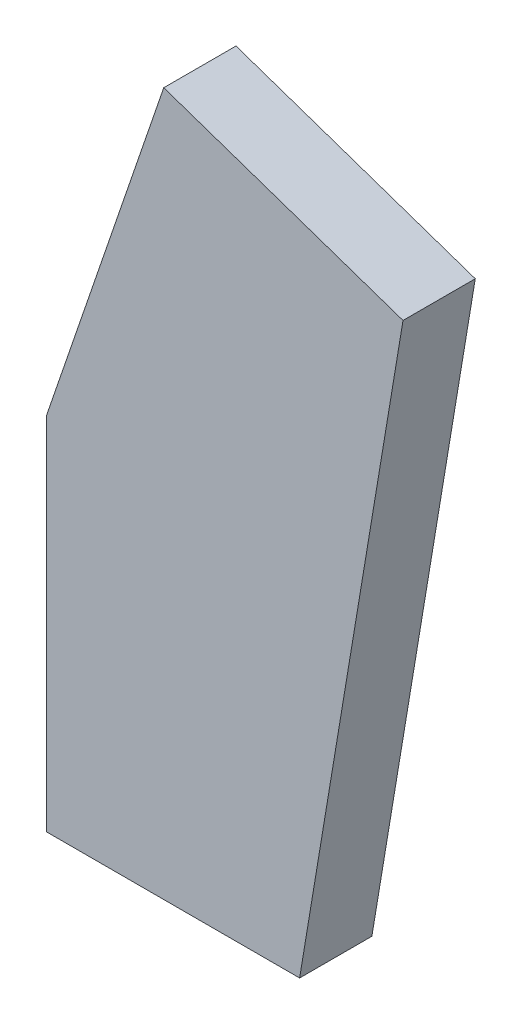
ISO-10303-21;
HEADER;
FILE_DESCRIPTION(('STEP AP214'),'2;1');
FILE_NAME('part.step','',(''),(''),'','','');
FILE_SCHEMA(('AUTOMOTIVE_DESIGN { 1 0 10303 214 1 1 1 1 }'));
ENDSEC;
DATA;
#1=APPLICATION_CONTEXT('core data for automotive mechanical design processes');
#2=APPLICATION_PROTOCOL_DEFINITION('international standard','automotive_design',2000,#1);
#3=PRODUCT_CONTEXT('',#1,'mechanical');
#4=PRODUCT('Part','Part','',(#3));
#5=PRODUCT_RELATED_PRODUCT_CATEGORY('part','',(#4));
#6=PRODUCT_DEFINITION_FORMATION('','',#4);
#7=PRODUCT_DEFINITION_CONTEXT('part definition',#1,'design');
#8=PRODUCT_DEFINITION('design','',#6,#7);
#9=PRODUCT_DEFINITION_SHAPE('','',#8);
#10=(LENGTH_UNIT() NAMED_UNIT(*) SI_UNIT(.MILLI.,.METRE.));
#11=(NAMED_UNIT(*) PLANE_ANGLE_UNIT() SI_UNIT($,.RADIAN.));
#12=(NAMED_UNIT(*) SI_UNIT($,.STERADIAN.) SOLID_ANGLE_UNIT());
#13=UNCERTAINTY_MEASURE_WITH_UNIT(LENGTH_MEASURE(1.E-05),#10,'distance_accuracy_value','');
#14=(GEOMETRIC_REPRESENTATION_CONTEXT(3) GLOBAL_UNCERTAINTY_ASSIGNED_CONTEXT((#13)) GLOBAL_UNIT_ASSIGNED_CONTEXT((#10,
#11,#12)) REPRESENTATION_CONTEXT('',''));
#15=CARTESIAN_POINT('',(0.,0.,0.));
#16=DIRECTION('',(0.,0.,1.));
#17=DIRECTION('',(1.,0.,0.));
#18=AXIS2_PLACEMENT_3D('',#15,#16,#17);
#19=CARTESIAN_POINT('',(0.,-50.,10.));
#20=DIRECTION('',(0.,1.,0.));
#21=DIRECTION('',(0.,0.,1.));
#22=AXIS2_PLACEMENT_3D('',#19,#20,#21);
#23=PLANE('',#22);
#24=DIRECTION('',(1.,0.,0.));
#25=VECTOR('',#24,1.);
#26=CARTESIAN_POINT('',(0.,-50.,0.));
#27=LINE('',#26,#25);
#28=CARTESIAN_POINT('',(0.,-50.,0.));
#29=VERTEX_POINT('',#28);
#30=CARTESIAN_POINT('',(35.,-50.,0.));
#31=VERTEX_POINT('',#30);
#32=EDGE_CURVE('E107',#29,#31,#27,.T.);
#33=ORIENTED_EDGE('',*,*,#32,.T.);
#34=DIRECTION('',(0.,0.,-1.));
#35=VECTOR('',#34,1.);
#36=CARTESIAN_POINT('',(35.,-50.,10.));
#37=LINE('',#36,#35);
#38=CARTESIAN_POINT('',(35.,-50.,10.));
#39=VERTEX_POINT('',#38);
#40=EDGE_CURVE('E11',#39,#31,#37,.T.);
#41=ORIENTED_EDGE('',*,*,#40,.F.);
#42=DIRECTION('',(1.,0.,0.));
#43=VECTOR('',#42,1.);
#44=CARTESIAN_POINT('',(0.,-50.,10.));
#45=LINE('',#44,#43);
#46=CARTESIAN_POINT('',(0.,-50.,10.));
#47=VERTEX_POINT('',#46);
#48=EDGE_CURVE('E115',#47,#39,#45,.T.);
#49=ORIENTED_EDGE('',*,*,#48,.F.);
#50=DIRECTION('',(0.,0.,-1.));
#51=VECTOR('',#50,1.);
#52=CARTESIAN_POINT('',(0.,-50.,10.));
#53=LINE('',#52,#51);
#54=EDGE_CURVE('E103',#47,#29,#53,.T.);
#55=ORIENTED_EDGE('',*,*,#54,.T.);
#56=EDGE_LOOP('',(#33,#41,#49,#55));
#57=FACE_BOUND('',#56,.T.);
#58=ADVANCED_FACE('F33',(#57),#23,.F.);
#59=CARTESIAN_POINT('',(49.3088584688714,35.9671583044422,10.));
#60=DIRECTION('',(-0.986429257176496,0.164186846568861,0.));
#61=DIRECTION('',(-0.164186846568861,-0.986429257176496,0.));
#62=AXIS2_PLACEMENT_3D('',#59,#60,#61);
#63=PLANE('',#62);
#64=DIRECTION('',(0.164186846568861,0.986429257176496,0.));
#65=VECTOR('',#64,1.);
#66=CARTESIAN_POINT('',(49.3088584688714,35.9671583044422,0.));
#67=LINE('',#66,#65);
#68=CARTESIAN_POINT('',(49.3088584688714,35.9671583044422,0.));
#69=VERTEX_POINT('',#68);
#70=EDGE_CURVE('E110',#31,#69,#67,.T.);
#71=ORIENTED_EDGE('',*,*,#70,.T.);
#72=DIRECTION('',(0.,0.,-1.));
#73=VECTOR('',#72,1.);
#74=CARTESIAN_POINT('',(49.3088584688714,35.9671583044422,10.));
#75=LINE('',#74,#73);
#76=CARTESIAN_POINT('',(49.3088584688714,35.9671583044422,10.));
#77=VERTEX_POINT('',#76);
#78=EDGE_CURVE('E41',#77,#69,#75,.T.);
#79=ORIENTED_EDGE('',*,*,#78,.F.);
#80=DIRECTION('',(0.164186846568861,0.986429257176496,0.));
#81=VECTOR('',#80,1.);
#82=CARTESIAN_POINT('',(49.3088584688714,35.9671583044422,10.));
#83=LINE('',#82,#81);
#84=EDGE_CURVE('E83',#39,#77,#83,.T.);
#85=ORIENTED_EDGE('',*,*,#84,.F.);
#86=ORIENTED_EDGE('',*,*,#40,.T.);
#87=EDGE_LOOP('',(#71,#79,#85,#86));
#88=FACE_BOUND('',#87,.T.);
#89=ADVANCED_FACE('F134',(#88),#63,.F.);
#90=CARTESIAN_POINT('',(16.1958709099073,47.3042679413773,10.));
#91=DIRECTION('',(-0.323917418198147,-0.946085358827546,0.));
#92=DIRECTION('',(0.946085358827546,-0.323917418198147,0.));
#93=AXIS2_PLACEMENT_3D('',#90,#91,#92);
#94=PLANE('',#93);
#95=DIRECTION('',(-0.946085358827546,0.323917418198147,0.));
#96=VECTOR('',#95,1.);
#97=CARTESIAN_POINT('',(16.1958709099073,47.3042679413773,0.));
#98=LINE('',#97,#96);
#99=CARTESIAN_POINT('',(16.1958709099073,47.3042679413773,0.));
#100=VERTEX_POINT('',#99);
#101=EDGE_CURVE('E98',#69,#100,#98,.T.);
#102=ORIENTED_EDGE('',*,*,#101,.T.);
#103=DIRECTION('',(0.,0.,-1.));
#104=VECTOR('',#103,1.);
#105=CARTESIAN_POINT('',(16.1958709099073,47.3042679413773,10.));
#106=LINE('',#105,#104);
#107=CARTESIAN_POINT('',(16.1958709099073,47.3042679413773,10.));
#108=VERTEX_POINT('',#107);
#109=EDGE_CURVE('E95',#108,#100,#106,.T.);
#110=ORIENTED_EDGE('',*,*,#109,.F.);
#111=DIRECTION('',(-0.946085358827546,0.323917418198147,0.));
#112=VECTOR('',#111,1.);
#113=CARTESIAN_POINT('',(16.1958709099073,47.3042679413773,10.));
#114=LINE('',#113,#112);
#115=EDGE_CURVE('E87',#77,#108,#114,.T.);
#116=ORIENTED_EDGE('',*,*,#115,.F.);
#117=ORIENTED_EDGE('',*,*,#78,.T.);
#118=EDGE_LOOP('',(#102,#110,#116,#117));
#119=FACE_BOUND('',#118,.T.);
#120=ADVANCED_FACE('F96',(#119),#94,.F.);
#121=CARTESIAN_POINT('',(0.,0.,10.));
#122=DIRECTION('',(0.946085358827546,-0.323917418198147,0.));
#123=DIRECTION('',(0.323917418198147,0.946085358827547,0.));
#124=AXIS2_PLACEMENT_3D('',#121,#122,#123);
#125=PLANE('',#124);
#126=DIRECTION('',(-0.323917418198147,-0.946085358827546,0.));
#127=VECTOR('',#126,1.);
#128=CARTESIAN_POINT('',(0.,0.,0.));
#129=LINE('',#128,#127);
#130=CARTESIAN_POINT('',(0.,0.,0.));
#131=VERTEX_POINT('',#130);
#132=EDGE_CURVE('E69',#100,#131,#129,.T.);
#133=ORIENTED_EDGE('',*,*,#132,.T.);
#134=DIRECTION('',(0.,0.,-1.));
#135=VECTOR('',#134,1.);
#136=CARTESIAN_POINT('',(0.,0.,10.));
#137=LINE('',#136,#135);
#138=CARTESIAN_POINT('',(0.,0.,10.));
#139=VERTEX_POINT('',#138);
#140=EDGE_CURVE('E99',#139,#131,#137,.T.);
#141=ORIENTED_EDGE('',*,*,#140,.F.);
#142=DIRECTION('',(-0.323917418198147,-0.946085358827546,0.));
#143=VECTOR('',#142,1.);
#144=CARTESIAN_POINT('',(0.,0.,10.));
#145=LINE('',#144,#143);
#146=EDGE_CURVE('E91',#108,#139,#145,.T.);
#147=ORIENTED_EDGE('',*,*,#146,.F.);
#148=ORIENTED_EDGE('',*,*,#109,.T.);
#149=EDGE_LOOP('',(#133,#141,#147,#148));
#150=FACE_BOUND('',#149,.T.);
#151=ADVANCED_FACE('F101',(#150),#125,.F.);
#152=CARTESIAN_POINT('',(0.,-50.,10.));
#153=DIRECTION('',(1.,0.,0.));
#154=DIRECTION('',(0.,0.,-1.));
#155=AXIS2_PLACEMENT_3D('',#152,#153,#154);
#156=PLANE('',#155);
#157=DIRECTION('',(0.,-1.,0.));
#158=VECTOR('',#157,1.);
#159=CARTESIAN_POINT('',(0.,-50.,0.));
#160=LINE('',#159,#158);
#161=EDGE_CURVE('E75',#131,#29,#160,.T.);
#162=ORIENTED_EDGE('',*,*,#161,.T.);
#163=ORIENTED_EDGE('',*,*,#54,.F.);
#164=DIRECTION('',(0.,-1.,0.));
#165=VECTOR('',#164,1.);
#166=CARTESIAN_POINT('',(0.,-50.,10.));
#167=LINE('',#166,#165);
#168=EDGE_CURVE('E49',#139,#47,#167,.T.);
#169=ORIENTED_EDGE('',*,*,#168,.F.);
#170=ORIENTED_EDGE('',*,*,#140,.T.);
#171=EDGE_LOOP('',(#162,#163,#169,#170));
#172=FACE_BOUND('',#171,.T.);
#173=ADVANCED_FACE('F123',(#172),#156,.F.);
#174=CARTESIAN_POINT('',(0.,0.,10.));
#175=DIRECTION('',(0.,0.,1.));
#176=DIRECTION('',(1.,0.,0.));
#177=AXIS2_PLACEMENT_3D('',#174,#175,#176);
#178=PLANE('',#177);
#179=ORIENTED_EDGE('',*,*,#48,.T.);
#180=ORIENTED_EDGE('',*,*,#84,.T.);
#181=ORIENTED_EDGE('',*,*,#115,.T.);
#182=ORIENTED_EDGE('',*,*,#146,.T.);
#183=ORIENTED_EDGE('',*,*,#168,.T.);
#184=EDGE_LOOP('',(#179,#180,#181,#182,#183));
#185=FACE_BOUND('',#184,.T.);
#186=ADVANCED_FACE('F89',(#185),#178,.T.);
#187=CARTESIAN_POINT('',(0.,0.,0.));
#188=DIRECTION('',(0.,0.,1.));
#189=DIRECTION('',(1.,0.,0.));
#190=AXIS2_PLACEMENT_3D('',#187,#188,#189);
#191=PLANE('',#190);
#192=ORIENTED_EDGE('',*,*,#32,.F.);
#193=ORIENTED_EDGE('',*,*,#161,.F.);
#194=ORIENTED_EDGE('',*,*,#132,.F.);
#195=ORIENTED_EDGE('',*,*,#101,.F.);
#196=ORIENTED_EDGE('',*,*,#70,.F.);
#197=EDGE_LOOP('',(#192,#193,#194,#195,#196));
#198=FACE_BOUND('',#197,.T.);
#199=ADVANCED_FACE('F119',(#198),#191,.F.);
#200=CLOSED_SHELL('',(#58,#89,#120,#151,#173,#186,#199));
#201=MANIFOLD_SOLID_BREP('B2',#200);
#202=ADVANCED_BREP_SHAPE_REPRESENTATION('',(#18,#201),#14);
#203=SHAPE_DEFINITION_REPRESENTATION(#9,#202);
ENDSEC;
END-ISO-10303-21;
